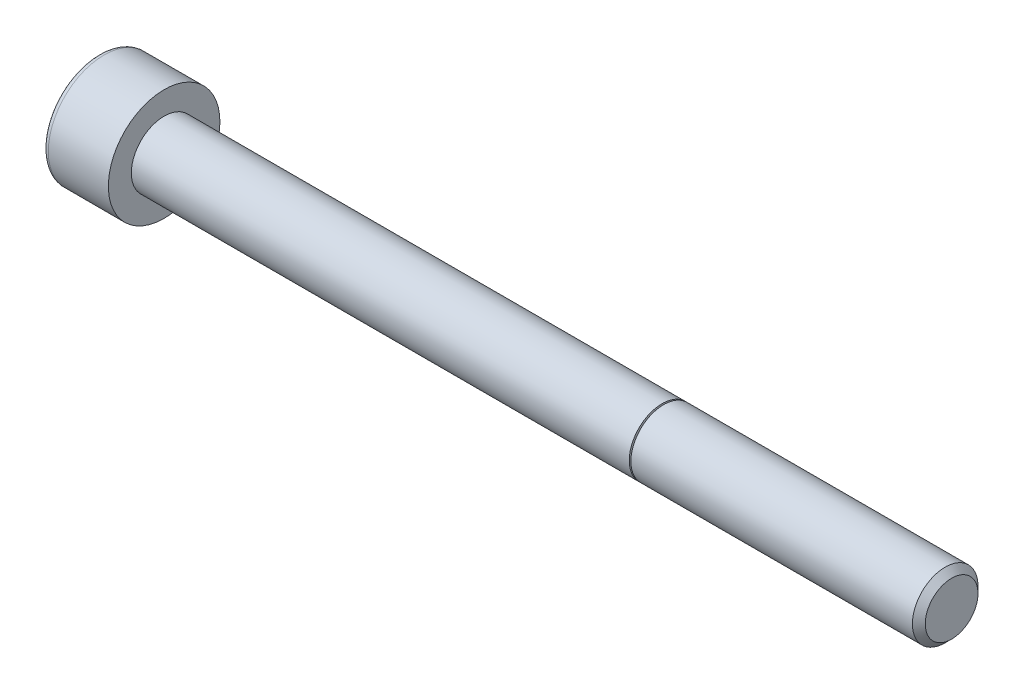
ISO-10303-21;
HEADER;
FILE_DESCRIPTION(('STEP AP214'),'2;1');
FILE_NAME('part.step','',(''),(''),'','','');
FILE_SCHEMA(('AUTOMOTIVE_DESIGN { 1 0 10303 214 1 1 1 1 }'));
ENDSEC;
DATA;
#1=APPLICATION_CONTEXT('core data for automotive mechanical design processes');
#2=APPLICATION_PROTOCOL_DEFINITION('international standard','automotive_design',2000,#1);
#3=PRODUCT_CONTEXT('',#1,'mechanical');
#4=PRODUCT('Part','Part','',(#3));
#5=PRODUCT_RELATED_PRODUCT_CATEGORY('part','',(#4));
#6=PRODUCT_DEFINITION_FORMATION('','',#4);
#7=PRODUCT_DEFINITION_CONTEXT('part definition',#1,'design');
#8=PRODUCT_DEFINITION('design','',#6,#7);
#9=PRODUCT_DEFINITION_SHAPE('','',#8);
#10=(LENGTH_UNIT() NAMED_UNIT(*) SI_UNIT(.MILLI.,.METRE.));
#11=(NAMED_UNIT(*) PLANE_ANGLE_UNIT() SI_UNIT($,.RADIAN.));
#12=(NAMED_UNIT(*) SI_UNIT($,.STERADIAN.) SOLID_ANGLE_UNIT());
#13=UNCERTAINTY_MEASURE_WITH_UNIT(LENGTH_MEASURE(1.E-05),#10,'distance_accuracy_value','');
#14=(GEOMETRIC_REPRESENTATION_CONTEXT(3) GLOBAL_UNCERTAINTY_ASSIGNED_CONTEXT((#13)) GLOBAL_UNIT_ASSIGNED_CONTEXT((#10,
#11,#12)) REPRESENTATION_CONTEXT('',''));
#15=CARTESIAN_POINT('',(0.,0.,0.));
#16=DIRECTION('',(0.,0.,1.));
#17=DIRECTION('',(1.,0.,0.));
#18=AXIS2_PLACEMENT_3D('',#15,#16,#17);
#19=CARTESIAN_POINT('',(60.,-2.04969,2.0095));
#20=DIRECTION('',(1.,0.,0.));
#21=DIRECTION('',(0.,0.,-1.));
#22=AXIS2_PLACEMENT_3D('',#19,#20,#21);
#23=PLANE('',#22);
#24=CARTESIAN_POINT('',(60.,0.,0.));
#25=DIRECTION('',(-1.,0.,0.));
#26=DIRECTION('',(0.,0.,1.));
#27=AXIS2_PLACEMENT_3D('',#24,#25,#26);
#28=CIRCLE('',#27,2.0095);
#29=CARTESIAN_POINT('',(60.,0.,2.0095));
#30=VERTEX_POINT('',#29);
#31=EDGE_CURVE('E20',#30,#30,#28,.T.);
#32=ORIENTED_EDGE('',*,*,#31,.F.);
#33=EDGE_LOOP('',(#32));
#34=FACE_BOUND('',#33,.T.);
#35=ADVANCED_FACE('F16',(#34),#23,.T.);
#36=CARTESIAN_POINT('',(60.,0.,0.));
#37=DIRECTION('',(-1.,0.,0.));
#38=DIRECTION('',(0.,0.,1.));
#39=AXIS2_PLACEMENT_3D('',#36,#37,#38);
#40=CONICAL_SURFACE('',#39,2.0095,0.785398163397458);
#41=ORIENTED_EDGE('',*,*,#31,.T.);
#42=EDGE_LOOP('',(#41));
#43=FACE_BOUND('',#42,.T.);
#44=CARTESIAN_POINT('',(59.5095,0.,0.));
#45=DIRECTION('',(-1.,0.,0.));
#46=DIRECTION('',(0.,-1.,0.));
#47=AXIS2_PLACEMENT_3D('',#44,#45,#46);
#48=CIRCLE('',#47,2.5);
#49=CARTESIAN_POINT('',(59.5095,-2.49999999999999,0.));
#50=VERTEX_POINT('',#49);
#51=EDGE_CURVE('E122',#50,#50,#48,.T.);
#52=ORIENTED_EDGE('',*,*,#51,.F.);
#53=EDGE_LOOP('',(#52));
#54=FACE_BOUND('',#53,.T.);
#55=ADVANCED_FACE('F235',(#43,#54),#40,.T.);
#56=CARTESIAN_POINT('',(59.5095,0.,0.));
#57=DIRECTION('',(-1.,0.,0.));
#58=DIRECTION('',(0.,-1.,0.));
#59=AXIS2_PLACEMENT_3D('',#56,#57,#58);
#60=CYLINDRICAL_SURFACE('',#59,2.5);
#61=CARTESIAN_POINT('',(38.0613125,0.,0.));
#62=DIRECTION('',(-1.,0.,0.));
#63=DIRECTION('',(0.,0.,1.));
#64=AXIS2_PLACEMENT_3D('',#61,#62,#63);
#65=CIRCLE('',#64,2.5);
#66=CARTESIAN_POINT('',(38.0613125,0.,2.5));
#67=VERTEX_POINT('',#66);
#68=EDGE_CURVE('E119',#67,#67,#65,.T.);
#69=ORIENTED_EDGE('',*,*,#68,.F.);
#70=EDGE_LOOP('',(#69));
#71=FACE_BOUND('',#70,.T.);
#72=ORIENTED_EDGE('',*,*,#51,.T.);
#73=EDGE_LOOP('',(#72));
#74=FACE_BOUND('',#73,.T.);
#75=ADVANCED_FACE('F229',(#71,#74),#60,.T.);
#76=CARTESIAN_POINT('',(38.,0.,0.));
#77=DIRECTION('',(1.,0.,0.));
#78=DIRECTION('',(0.,0.,-1.));
#79=AXIS2_PLACEMENT_3D('',#76,#77,#78);
#80=CONICAL_SURFACE('',#79,2.0094999999999,1.44644133224815);
#81=CARTESIAN_POINT('',(38.,0.,0.));
#82=DIRECTION('',(-1.,0.,0.));
#83=DIRECTION('',(0.,0.,1.));
#84=AXIS2_PLACEMENT_3D('',#81,#82,#83);
#85=CIRCLE('',#84,2.0094999999999);
#86=CARTESIAN_POINT('',(38.,0.,2.0094999999999));
#87=VERTEX_POINT('',#86);
#88=EDGE_CURVE('E116',#87,#87,#85,.T.);
#89=ORIENTED_EDGE('',*,*,#88,.F.);
#90=EDGE_LOOP('',(#89));
#91=FACE_BOUND('',#90,.T.);
#92=ORIENTED_EDGE('',*,*,#68,.T.);
#93=EDGE_LOOP('',(#92));
#94=FACE_BOUND('',#93,.T.);
#95=ADVANCED_FACE('F223',(#91,#94),#80,.T.);
#96=CARTESIAN_POINT('',(37.9386875,0.,0.));
#97=DIRECTION('',(-1.,0.,0.));
#98=DIRECTION('',(0.,0.,1.));
#99=AXIS2_PLACEMENT_3D('',#96,#97,#98);
#100=CONICAL_SURFACE('',#99,2.5,1.44644133224815);
#101=CARTESIAN_POINT('',(37.9386875,0.,0.));
#102=DIRECTION('',(-1.,0.,0.));
#103=DIRECTION('',(0.,0.,1.));
#104=AXIS2_PLACEMENT_3D('',#101,#102,#103);
#105=CIRCLE('',#104,2.5);
#106=CARTESIAN_POINT('',(37.9386875,0.,2.50000000000001));
#107=VERTEX_POINT('',#106);
#108=EDGE_CURVE('E113',#107,#107,#105,.T.);
#109=ORIENTED_EDGE('',*,*,#108,.F.);
#110=EDGE_LOOP('',(#109));
#111=FACE_BOUND('',#110,.T.);
#112=ORIENTED_EDGE('',*,*,#88,.T.);
#113=EDGE_LOOP('',(#112));
#114=FACE_BOUND('',#113,.T.);
#115=ADVANCED_FACE('F218',(#111,#114),#100,.T.);
#116=CARTESIAN_POINT('',(37.9386875,0.,0.));
#117=DIRECTION('',(-1.,0.,0.));
#118=DIRECTION('',(0.,0.,1.));
#119=AXIS2_PLACEMENT_3D('',#116,#117,#118);
#120=CYLINDRICAL_SURFACE('',#119,2.5);
#121=CARTESIAN_POINT('',(0.,0.,0.));
#122=DIRECTION('',(-1.,0.,0.));
#123=DIRECTION('',(0.,0.,1.));
#124=AXIS2_PLACEMENT_3D('',#121,#122,#123);
#125=CIRCLE('',#124,2.5);
#126=CARTESIAN_POINT('',(0.,0.,2.50000000000001));
#127=VERTEX_POINT('',#126);
#128=EDGE_CURVE('E92',#127,#127,#125,.T.);
#129=ORIENTED_EDGE('',*,*,#128,.F.);
#130=EDGE_LOOP('',(#129));
#131=FACE_BOUND('',#130,.T.);
#132=ORIENTED_EDGE('',*,*,#108,.T.);
#133=EDGE_LOOP('',(#132));
#134=FACE_BOUND('',#133,.T.);
#135=ADVANCED_FACE('F215',(#131,#134),#120,.T.);
#136=CARTESIAN_POINT('',(-1.9,0.,0.));
#137=DIRECTION('',(-1.,0.,0.));
#138=DIRECTION('',(0.,0.,1.));
#139=AXIS2_PLACEMENT_3D('',#136,#137,#138);
#140=CONICAL_SURFACE('',#139,2.3094010767585,1.0471975511966);
#141=CARTESIAN_POINT('',(-1.9,0.,2.3094010767585));
#142=CARTESIAN_POINT('',(-1.87069554512665,-0.0878878875630438,2.25865898121547));
#143=CARTESIAN_POINT('',(-1.84404467710022,-0.176534422121215,2.20747888062559));
#144=CARTESIAN_POINT('',(-1.79752638740027,-0.355362346686105,2.10423253023943));
#145=CARTESIAN_POINT('',(-1.77767542033809,-0.44554691308464,2.05216444655249));
#146=CARTESIAN_POINT('',(-1.74677595894609,-0.624798433758891,1.94867353283856));
#147=CARTESIAN_POINT('',(-1.73552178759691,-0.713837815616439,1.89726662175463));
#148=CARTESIAN_POINT('',(-1.72208916813045,-0.892335320462004,1.79421103928237));
#149=CARTESIAN_POINT('',(-1.7198995939742,-0.981792795105295,1.74256274221605));
#150=CARTESIAN_POINT('',(-1.72446629015479,-1.14893448970974,1.64606343984337));
#151=CARTESIAN_POINT('',(-1.73010128521626,-1.22664379064383,1.60119795403054));
#152=CARTESIAN_POINT('',(-1.74795730071816,-1.38155614176471,1.5117592664101));
#153=CARTESIAN_POINT('',(-1.76018441476867,-1.45875865655097,1.46718637371614));
#154=CARTESIAN_POINT('',(-1.79074983333835,-1.61399014172453,1.37756343396448));
#155=CARTESIAN_POINT('',(-1.80921764221832,-1.69199947538354,1.33252472417715));
#156=CARTESIAN_POINT('',(-1.85113176083937,-1.84685497000488,1.24311886267203));
#157=CARTESIAN_POINT('',(-1.87456822875222,-1.92370311331472,1.19875056644538));
#158=CARTESIAN_POINT('',(-1.90000000000001,-1.99999999999999,1.15470053837931));
#159=B_SPLINE_CURVE_WITH_KNOTS('',3,(#141,#142,#143,#144,#145,#146,#147,#148,#149,#150,#151,
#152,#153,#154,#155,#156,#157,#158),.UNSPECIFIED.,.F.,.F.,(4,2,2,2,2,2,2,2,4),(0.,
0.317016011556855,0.634793817027109,0.944707606152922,1.25424088889782,1.52370778263188,
1.79342419379439,2.06912162248864,2.34427797351492),.UNSPECIFIED.);
#160=CARTESIAN_POINT('',(-1.9,0.,2.3094010767585));
#161=VERTEX_POINT('',#160);
#162=CARTESIAN_POINT('',(-1.90000000000001,-2.,1.1547005383793));
#163=VERTEX_POINT('',#162);
#164=EDGE_CURVE('E82',#161,#163,#159,.T.);
#165=ORIENTED_EDGE('',*,*,#164,.F.);
#166=CARTESIAN_POINT('',(-1.90000000000002,2.,1.1547005383793));
#167=CARTESIAN_POINT('',(-1.87069554512667,1.91211211243696,1.20544263392233));
#168=CARTESIAN_POINT('',(-1.84404467710023,1.82346557787879,1.25662273451221));
#169=CARTESIAN_POINT('',(-1.79752638740028,1.6446376533139,1.35986908489837));
#170=CARTESIAN_POINT('',(-1.7776754203381,1.55445308691536,1.41193716858531));
#171=CARTESIAN_POINT('',(-1.74677595894609,1.37520156624111,1.51542808229924));
#172=CARTESIAN_POINT('',(-1.73552178759691,1.28616218438356,1.56683499338317));
#173=CARTESIAN_POINT('',(-1.72208916813045,1.10766467953799,1.66989057585543));
#174=CARTESIAN_POINT('',(-1.7198995939742,1.0182072048947,1.72153887292176));
#175=CARTESIAN_POINT('',(-1.72446629015479,0.851065510290257,1.81803817529444));
#176=CARTESIAN_POINT('',(-1.73010128521625,0.773356209356166,1.86290366110727));
#177=CARTESIAN_POINT('',(-1.74795730071815,0.618443858235278,1.95234234872771));
#178=CARTESIAN_POINT('',(-1.76018441476867,0.541241343449025,1.99691524142166));
#179=CARTESIAN_POINT('',(-1.79074983333834,0.386009858275461,2.08653818117332));
#180=CARTESIAN_POINT('',(-1.80921764221831,0.308000524616451,2.13157689096065));
#181=CARTESIAN_POINT('',(-1.85113176083936,0.153145029995107,2.22098275246578));
#182=CARTESIAN_POINT('',(-1.87456822875221,0.0762968866852722,2.26535104869243));
#183=CARTESIAN_POINT('',(-1.9,0.,2.3094010767585));
#184=B_SPLINE_CURVE_WITH_KNOTS('',3,(#166,#167,#168,#169,#170,#171,#172,#173,#174,#175,#176,
#177,#178,#179,#180,#181,#182,#183),.UNSPECIFIED.,.F.,.F.,(4,2,2,2,2,2,2,2,4),(0.,
0.317016011556859,0.634793817027117,0.944707606152934,1.25424088889784,1.5237077826319,
1.7934241937944,2.06912162248865,2.34427797351493),.UNSPECIFIED.);
#185=CARTESIAN_POINT('',(-1.90000000000001,2.,1.15470053837929));
#186=VERTEX_POINT('',#185);
#187=EDGE_CURVE('E79',#186,#161,#184,.T.);
#188=ORIENTED_EDGE('',*,*,#187,.F.);
#189=CARTESIAN_POINT('',(-1.9,2.,-1.15470053837923));
#190=CARTESIAN_POINT('',(-1.87069554512665,2.,-1.05321634729317));
#191=CARTESIAN_POINT('',(-1.84404467710021,2.,-0.950856146113392));
#192=CARTESIAN_POINT('',(-1.79752638740026,2.,-0.744363445341073));
#193=CARTESIAN_POINT('',(-1.77767542033809,2.,-0.640227277967187));
#194=CARTESIAN_POINT('',(-1.74677595894608,2.,-0.433245450539333));
#195=CARTESIAN_POINT('',(-1.7355217875969,2.,-0.330431628371469));
#196=CARTESIAN_POINT('',(-1.72208916813044,2.,-0.124320463426946));
#197=CARTESIAN_POINT('',(-1.71989959397419,2.,-0.0210238692942912));
#198=CARTESIAN_POINT('',(-1.72446629015478,2.,0.171974735451078));
#199=CARTESIAN_POINT('',(-1.73010128521625,2.,0.261705707076751));
#200=CARTESIAN_POINT('',(-1.74795730071815,2.,0.44058308231764));
#201=CARTESIAN_POINT('',(-1.76018441476866,2.,0.529728867705562));
#202=CARTESIAN_POINT('',(-1.79074983333834,2.,0.708974747208891));
#203=CARTESIAN_POINT('',(-1.80921764221831,2.,0.799052166783559));
#204=CARTESIAN_POINT('',(-1.85113176083936,2.,0.977863889793815));
#205=CARTESIAN_POINT('',(-1.87456822875222,2.,1.06660048224713));
#206=CARTESIAN_POINT('',(-1.90000000000001,2.,1.15470053837928));
#207=B_SPLINE_CURVE_WITH_KNOTS('',3,(#189,#190,#191,#192,#193,#194,#195,#196,#197,#198,#199,
#200,#201,#202,#203,#204,#205,#206),.UNSPECIFIED.,.F.,.F.,(4,2,2,2,2,2,2,2,4),(0.,
0.317016011556853,0.634793817027106,0.944707606152917,1.25424088889781,1.52370778263189,
1.7934241937944,2.06912162248866,2.34427797351496),.UNSPECIFIED.);
#208=CARTESIAN_POINT('',(-1.89999999999999,2.,-1.15470053837921));
#209=VERTEX_POINT('',#208);
#210=EDGE_CURVE('E67',#209,#186,#207,.T.);
#211=ORIENTED_EDGE('',*,*,#210,.F.);
#212=CARTESIAN_POINT('',(-1.9,0.,-2.3094010767585));
#213=CARTESIAN_POINT('',(-1.87069554512665,0.0878878875630413,-2.25865898121547));
#214=CARTESIAN_POINT('',(-1.84404467710021,0.17653442212121,-2.20747888062558));
#215=CARTESIAN_POINT('',(-1.79752638740026,0.355362346686095,-2.10423253023942));
#216=CARTESIAN_POINT('',(-1.77767542033808,0.445546913084628,-2.05216444655247));
#217=CARTESIAN_POINT('',(-1.74677595894607,0.624798433758874,-1.94867353283854));
#218=CARTESIAN_POINT('',(-1.73552178759689,0.71383781561642,-1.89726662175461));
#219=CARTESIAN_POINT('',(-1.72208916813043,0.89233532046198,-1.79421103928234));
#220=CARTESIAN_POINT('',(-1.71989959397418,0.981792795105269,-1.74256274221601));
#221=CARTESIAN_POINT('',(-1.72446629015476,1.14893448970971,-1.64606343984333));
#222=CARTESIAN_POINT('',(-1.73010128521623,1.2266437906438,-1.60119795403049));
#223=CARTESIAN_POINT('',(-1.74795730071813,1.3815561417647,-1.51175926641004));
#224=CARTESIAN_POINT('',(-1.76018441476864,1.45875865655095,-1.46718637371607));
#225=CARTESIAN_POINT('',(-1.79074983333831,1.61399014172452,-1.37756343396441));
#226=CARTESIAN_POINT('',(-1.80921764221829,1.69199947538354,-1.33252472417707));
#227=CARTESIAN_POINT('',(-1.85113176083934,1.84685497000489,-1.24311886267194));
#228=CARTESIAN_POINT('',(-1.87456822875219,1.92370311331472,-1.19875056644528));
#229=CARTESIAN_POINT('',(-1.89999999999999,2.,-1.1547005383792));
#230=B_SPLINE_CURVE_WITH_KNOTS('',3,(#212,#213,#214,#215,#216,#217,#218,#219,#220,#221,#222,
#223,#224,#225,#226,#227,#228,#229),.UNSPECIFIED.,.F.,.F.,(4,2,2,2,2,2,2,2,4),(0.,
0.317016011556855,0.634793817027109,0.944707606152921,1.25424088889782,1.5237077826319,
1.79342419379442,2.06912162248868,2.34427797351498),.UNSPECIFIED.);
#231=CARTESIAN_POINT('',(-1.9,0.,-2.3094010767585));
#232=VERTEX_POINT('',#231);
#233=EDGE_CURVE('E134',#232,#209,#230,.T.);
#234=ORIENTED_EDGE('',*,*,#233,.F.);
#235=CARTESIAN_POINT('',(-1.90000000000001,-1.99999999999999,-1.1547005383793));
#236=CARTESIAN_POINT('',(-1.87069554512666,-1.91211211243695,-1.20544263392233));
#237=CARTESIAN_POINT('',(-1.84404467710023,-1.82346557787878,-1.25662273451222));
#238=CARTESIAN_POINT('',(-1.79752638740027,-1.64463765331388,-1.35986908489838));
#239=CARTESIAN_POINT('',(-1.7776754203381,-1.55445308691535,-1.41193716858532));
#240=CARTESIAN_POINT('',(-1.74677595894609,-1.3752015662411,-1.51542808229924));
#241=CARTESIAN_POINT('',(-1.73552178759691,-1.28616218438355,-1.56683499338317));
#242=CARTESIAN_POINT('',(-1.72208916813045,-1.10766467953798,-1.66989057585543));
#243=CARTESIAN_POINT('',(-1.7198995939742,-1.01820720489469,-1.72153887292176));
#244=CARTESIAN_POINT('',(-1.72446629015479,-0.851065510290249,-1.81803817529444));
#245=CARTESIAN_POINT('',(-1.73010128521626,-0.773356209356158,-1.86290366110727));
#246=CARTESIAN_POINT('',(-1.74795730071816,-0.618443858235273,-1.95234234872771));
#247=CARTESIAN_POINT('',(-1.76018441476867,-0.541241343449019,-1.99691524142167));
#248=CARTESIAN_POINT('',(-1.79074983333834,-0.386009858275457,-2.08653818117332));
#249=CARTESIAN_POINT('',(-1.80921764221831,-0.308000524616448,-2.13157689096065));
#250=CARTESIAN_POINT('',(-1.85113176083936,-0.153145029995106,-2.22098275246578));
#251=CARTESIAN_POINT('',(-1.87456822875221,-0.0762968866852709,-2.26535104869243));
#252=CARTESIAN_POINT('',(-1.9,0.,-2.3094010767585));
#253=B_SPLINE_CURVE_WITH_KNOTS('',3,(#235,#236,#237,#238,#239,#240,#241,#242,#243,#244,#245,
#246,#247,#248,#249,#250,#251,#252),.UNSPECIFIED.,.F.,.F.,(4,2,2,2,2,2,2,2,4),(0.,
0.317016011556858,0.634793817027115,0.944707606152931,1.25424088889783,1.52370778263189,
1.79342419379439,2.06912162248864,2.34427797351492),.UNSPECIFIED.);
#254=CARTESIAN_POINT('',(-1.90000000000001,-2.,-1.1547005383793));
#255=VERTEX_POINT('',#254);
#256=EDGE_CURVE('E142',#255,#232,#253,.T.);
#257=ORIENTED_EDGE('',*,*,#256,.F.);
#258=CARTESIAN_POINT('',(-1.90000000000001,-2.,1.15470053837929));
#259=CARTESIAN_POINT('',(-1.87069554512666,-2.,1.05321634729323));
#260=CARTESIAN_POINT('',(-1.84404467710023,-2.,0.950856146113455));
#261=CARTESIAN_POINT('',(-1.79752638740027,-2.,0.744363445341134));
#262=CARTESIAN_POINT('',(-1.7776754203381,-2.,0.640227277967246));
#263=CARTESIAN_POINT('',(-1.74677595894609,-2.,0.43324545053939));
#264=CARTESIAN_POINT('',(-1.73552178759691,-2.,0.330431628371524));
#265=CARTESIAN_POINT('',(-1.72208916813044,-2.,0.124320463426999));
#266=CARTESIAN_POINT('',(-1.71989959397419,-2.,0.0210238692943427));
#267=CARTESIAN_POINT('',(-1.72446629015478,-2.,-0.171974735451032));
#268=CARTESIAN_POINT('',(-1.73010128521624,-2.,-0.261705707076711));
#269=CARTESIAN_POINT('',(-1.74795730071814,-2.,-0.440583082317611));
#270=CARTESIAN_POINT('',(-1.76018441476866,-2.,-0.529728867705538));
#271=CARTESIAN_POINT('',(-1.79074983333833,-2.,-0.708974747208878));
#272=CARTESIAN_POINT('',(-1.80921764221831,-2.,-0.799052166783552));
#273=CARTESIAN_POINT('',(-1.85113176083936,-2.,-0.977863889793819));
#274=CARTESIAN_POINT('',(-1.87456822875222,-2.,-1.06660048224714));
#275=CARTESIAN_POINT('',(-1.90000000000001,-2.,-1.15470053837929));
#276=B_SPLINE_CURVE_WITH_KNOTS('',3,(#258,#259,#260,#261,#262,#263,#264,#265,#266,#267,#268,
#269,#270,#271,#272,#273,#274,#275),.UNSPECIFIED.,.F.,.F.,(4,2,2,2,2,2,2,2,4),(0.,
0.317016011556858,0.634793817027115,0.944707606152931,1.25424088889783,1.52370778263192,
1.79342419379445,2.06912162248873,2.34427797351504),.UNSPECIFIED.);
#277=EDGE_CURVE('E184',#163,#255,#276,.T.);
#278=ORIENTED_EDGE('',*,*,#277,.F.);
#279=EDGE_LOOP('',(#165,#188,#211,#234,#257,#278));
#280=FACE_BOUND('',#279,.T.);
#281=CARTESIAN_POINT('',(-0.56666666666667,0.,0.));
#282=VERTEX_POINT('',#281);
#283=VERTEX_LOOP('',#282);
#284=FACE_BOUND('',#283,.T.);
#285=ADVANCED_FACE('F80',(#280,#284),#140,.F.);
#286=CARTESIAN_POINT('',(0.,-4.335,4.25));
#287=DIRECTION('',(1.,0.,0.));
#288=DIRECTION('',(0.,0.,-1.));
#289=AXIS2_PLACEMENT_3D('',#286,#287,#288);
#290=PLANE('',#289);
#291=CARTESIAN_POINT('',(0.,0.,0.));
#292=DIRECTION('',(1.,0.,0.));
#293=DIRECTION('',(0.,0.,-1.));
#294=AXIS2_PLACEMENT_3D('',#291,#292,#293);
#295=CIRCLE('',#294,4.25);
#296=CARTESIAN_POINT('',(0.,0.,-4.25));
#297=VERTEX_POINT('',#296);
#298=EDGE_CURVE('E107',#297,#297,#295,.F.);
#299=ORIENTED_EDGE('',*,*,#298,.F.);
#300=EDGE_LOOP('',(#299));
#301=FACE_BOUND('',#300,.T.);
#302=ORIENTED_EDGE('',*,*,#128,.T.);
#303=EDGE_LOOP('',(#302));
#304=FACE_BOUND('',#303,.T.);
#305=ADVANCED_FACE('F213',(#301,#304),#290,.T.);
#306=CARTESIAN_POINT('',(-5.,2.,-1.1547005383793));
#307=DIRECTION('',(0.,-1.,0.));
#308=DIRECTION('',(1.,0.,0.));
#309=AXIS2_PLACEMENT_3D('',#306,#307,#308);
#310=PLANE('',#309);
#311=DIRECTION('',(0.,0.,1.));
#312=VECTOR('',#311,1.);
#313=CARTESIAN_POINT('',(-4.99999999995,2.,0.));
#314=LINE('',#313,#312);
#315=CARTESIAN_POINT('',(-4.99999999995,2.,-1.15470053837925));
#316=VERTEX_POINT('',#315);
#317=CARTESIAN_POINT('',(-4.99999999995,2.,1.1547005383793));
#318=VERTEX_POINT('',#317);
#319=EDGE_CURVE('E72',#316,#318,#314,.T.);
#320=ORIENTED_EDGE('',*,*,#319,.F.);
#321=DIRECTION('',(-1.,0.,0.));
#322=VECTOR('',#321,1.);
#323=CARTESIAN_POINT('',(-3.28333333333335,2.,-1.1547005383792));
#324=LINE('',#323,#322);
#325=EDGE_CURVE('E90',#209,#316,#324,.T.);
#326=ORIENTED_EDGE('',*,*,#325,.F.);
#327=ORIENTED_EDGE('',*,*,#210,.T.);
#328=DIRECTION('',(1.,0.,0.));
#329=VECTOR('',#328,1.);
#330=CARTESIAN_POINT('',(-3.28333333333335,2.,1.1547005383793));
#331=LINE('',#330,#329);
#332=EDGE_CURVE('E86',#318,#186,#331,.T.);
#333=ORIENTED_EDGE('',*,*,#332,.F.);
#334=EDGE_LOOP('',(#320,#326,#327,#333));
#335=FACE_BOUND('',#334,.T.);
#336=ADVANCED_FACE('F88',(#335),#310,.T.);
#337=CARTESIAN_POINT('',(-5.,2.,1.1547005383793));
#338=DIRECTION('',(0.,-0.499999999999983,-0.866025403784448));
#339=DIRECTION('',(1.,0.,0.));
#340=AXIS2_PLACEMENT_3D('',#337,#338,#339);
#341=PLANE('',#340);
#342=DIRECTION('',(0.,-0.866025403784448,0.499999999999983));
#343=VECTOR('',#342,1.);
#344=CARTESIAN_POINT('',(-4.99999999995,2.,1.1547005383793));
#345=LINE('',#344,#343);
#346=CARTESIAN_POINT('',(-4.99999999995,0.,2.3094010767585));
#347=VERTEX_POINT('',#346);
#348=EDGE_CURVE('E96',#318,#347,#345,.T.);
#349=ORIENTED_EDGE('',*,*,#348,.F.);
#350=ORIENTED_EDGE('',*,*,#332,.T.);
#351=ORIENTED_EDGE('',*,*,#187,.T.);
#352=DIRECTION('',(1.,0.,0.));
#353=VECTOR('',#352,1.);
#354=CARTESIAN_POINT('',(-3.28333333333335,0.,2.3094010767585));
#355=LINE('',#354,#353);
#356=EDGE_CURVE('E98',#347,#161,#355,.T.);
#357=ORIENTED_EDGE('',*,*,#356,.F.);
#358=EDGE_LOOP('',(#349,#350,#351,#357));
#359=FACE_BOUND('',#358,.T.);
#360=ADVANCED_FACE('F94',(#359),#341,.T.);
#361=CARTESIAN_POINT('',(-5.,0.,2.3094010767585));
#362=DIRECTION('',(0.,0.499999999999983,-0.866025403784448));
#363=DIRECTION('',(1.,0.,0.));
#364=AXIS2_PLACEMENT_3D('',#361,#362,#363);
#365=PLANE('',#364);
#366=DIRECTION('',(0.,-0.866025403784448,-0.499999999999983));
#367=VECTOR('',#366,1.);
#368=CARTESIAN_POINT('',(-4.99999999995,0.,2.3094010767585));
#369=LINE('',#368,#367);
#370=CARTESIAN_POINT('',(-4.99999999995,-2.,1.1547005383793));
#371=VERTEX_POINT('',#370);
#372=EDGE_CURVE('E112',#347,#371,#369,.T.);
#373=ORIENTED_EDGE('',*,*,#372,.F.);
#374=ORIENTED_EDGE('',*,*,#356,.T.);
#375=ORIENTED_EDGE('',*,*,#164,.T.);
#376=DIRECTION('',(1.,0.,0.));
#377=VECTOR('',#376,1.);
#378=CARTESIAN_POINT('',(-3.28333333333335,-2.,1.1547005383793));
#379=LINE('',#378,#377);
#380=EDGE_CURVE('E180',#371,#163,#379,.T.);
#381=ORIENTED_EDGE('',*,*,#380,.F.);
#382=EDGE_LOOP('',(#373,#374,#375,#381));
#383=FACE_BOUND('',#382,.T.);
#384=ADVANCED_FACE('F195',(#383),#365,.T.);
#385=CARTESIAN_POINT('',(-5.,-2.,1.1547005383793));
#386=DIRECTION('',(0.,1.,0.));
#387=DIRECTION('',(1.,0.,0.));
#388=AXIS2_PLACEMENT_3D('',#385,#386,#387);
#389=PLANE('',#388);
#390=DIRECTION('',(0.,0.,-1.));
#391=VECTOR('',#390,1.);
#392=CARTESIAN_POINT('',(-4.99999999995,-2.,0.));
#393=LINE('',#392,#391);
#394=CARTESIAN_POINT('',(-4.99999999995,-2.,-1.1547005383793));
#395=VERTEX_POINT('',#394);
#396=EDGE_CURVE('E108',#371,#395,#393,.T.);
#397=ORIENTED_EDGE('',*,*,#396,.F.);
#398=ORIENTED_EDGE('',*,*,#380,.T.);
#399=ORIENTED_EDGE('',*,*,#277,.T.);
#400=DIRECTION('',(1.,0.,0.));
#401=VECTOR('',#400,1.);
#402=CARTESIAN_POINT('',(-3.28333333333335,-2.,-1.1547005383793));
#403=LINE('',#402,#401);
#404=EDGE_CURVE('E141',#395,#255,#403,.T.);
#405=ORIENTED_EDGE('',*,*,#404,.F.);
#406=EDGE_LOOP('',(#397,#398,#399,#405));
#407=FACE_BOUND('',#406,.T.);
#408=ADVANCED_FACE('F192',(#407),#389,.T.);
#409=CARTESIAN_POINT('',(-5.,-2.,-1.1547005383793));
#410=DIRECTION('',(0.,0.499999999999983,0.866025403784448));
#411=DIRECTION('',(1.,0.,0.));
#412=AXIS2_PLACEMENT_3D('',#409,#410,#411);
#413=PLANE('',#412);
#414=DIRECTION('',(0.,0.866025403784448,-0.499999999999983));
#415=VECTOR('',#414,1.);
#416=CARTESIAN_POINT('',(-4.99999999995,-2.,-1.1547005383793));
#417=LINE('',#416,#415);
#418=CARTESIAN_POINT('',(-4.99999999995,0.,-2.3094010767585));
#419=VERTEX_POINT('',#418);
#420=EDGE_CURVE('E111',#395,#419,#417,.T.);
#421=ORIENTED_EDGE('',*,*,#420,.F.);
#422=ORIENTED_EDGE('',*,*,#404,.T.);
#423=ORIENTED_EDGE('',*,*,#256,.T.);
#424=DIRECTION('',(1.,0.,0.));
#425=VECTOR('',#424,1.);
#426=CARTESIAN_POINT('',(-3.28333333333335,0.,-2.3094010767585));
#427=LINE('',#426,#425);
#428=EDGE_CURVE('E35',#419,#232,#427,.T.);
#429=ORIENTED_EDGE('',*,*,#428,.F.);
#430=EDGE_LOOP('',(#421,#422,#423,#429));
#431=FACE_BOUND('',#430,.T.);
#432=ADVANCED_FACE('F156',(#431),#413,.T.);
#433=CARTESIAN_POINT('',(-5.,0.,-2.3094010767585));
#434=DIRECTION('',(0.,-0.500000000000015,0.86602540378443));
#435=DIRECTION('',(1.,0.,0.));
#436=AXIS2_PLACEMENT_3D('',#433,#434,#435);
#437=PLANE('',#436);
#438=DIRECTION('',(0.,0.866025403784448,0.499999999999983));
#439=VECTOR('',#438,1.);
#440=CARTESIAN_POINT('',(-4.99999999995,0.,-2.3094010767585));
#441=LINE('',#440,#439);
#442=EDGE_CURVE('E105',#419,#316,#441,.T.);
#443=ORIENTED_EDGE('',*,*,#442,.F.);
#444=ORIENTED_EDGE('',*,*,#428,.T.);
#445=ORIENTED_EDGE('',*,*,#233,.T.);
#446=ORIENTED_EDGE('',*,*,#325,.T.);
#447=EDGE_LOOP('',(#443,#444,#445,#446));
#448=FACE_BOUND('',#447,.T.);
#449=ADVANCED_FACE('F151',(#448),#437,.T.);
#450=CARTESIAN_POINT('',(-4.575,0.,0.));
#451=DIRECTION('',(1.,0.,0.));
#452=DIRECTION('',(0.,0.,-1.));
#453=AXIS2_PLACEMENT_3D('',#450,#451,#452);
#454=CYLINDRICAL_SURFACE('',#453,4.25);
#455=ORIENTED_EDGE('',*,*,#298,.T.);
#456=EDGE_LOOP('',(#455));
#457=FACE_BOUND('',#456,.T.);
#458=CARTESIAN_POINT('',(-4.575,0.,0.));
#459=DIRECTION('',(-1.,0.,0.));
#460=DIRECTION('',(0.,0.,1.));
#461=AXIS2_PLACEMENT_3D('',#458,#459,#460);
#462=CIRCLE('',#461,4.2499999999);
#463=CARTESIAN_POINT('',(-4.575,0.,4.2499999999));
#464=VERTEX_POINT('',#463);
#465=EDGE_CURVE('E26',#464,#464,#462,.T.);
#466=ORIENTED_EDGE('',*,*,#465,.F.);
#467=EDGE_LOOP('',(#466));
#468=FACE_BOUND('',#467,.T.);
#469=ADVANCED_FACE('F155',(#457,#468),#454,.T.);
#470=CARTESIAN_POINT('',(-4.99999999995,-3.9015,-3.825));
#471=DIRECTION('',(-1.,0.,0.));
#472=DIRECTION('',(0.,0.,1.));
#473=AXIS2_PLACEMENT_3D('',#470,#471,#472);
#474=PLANE('',#473);
#475=ORIENTED_EDGE('',*,*,#420,.T.);
#476=ORIENTED_EDGE('',*,*,#442,.T.);
#477=ORIENTED_EDGE('',*,*,#319,.T.);
#478=ORIENTED_EDGE('',*,*,#348,.T.);
#479=ORIENTED_EDGE('',*,*,#372,.T.);
#480=ORIENTED_EDGE('',*,*,#396,.T.);
#481=EDGE_LOOP('',(#475,#476,#477,#478,#479,#480));
#482=FACE_BOUND('',#481,.T.);
#483=CARTESIAN_POINT('',(-4.9999999999,0.,0.));
#484=DIRECTION('',(1.,0.,0.));
#485=DIRECTION('',(0.,0.,-1.));
#486=AXIS2_PLACEMENT_3D('',#483,#484,#485);
#487=CIRCLE('',#486,3.82499999995044);
#488=CARTESIAN_POINT('',(-4.9999999999,0.,-3.82499999995044));
#489=VERTEX_POINT('',#488);
#490=EDGE_CURVE('E10',#489,#489,#487,.T.);
#491=ORIENTED_EDGE('',*,*,#490,.F.);
#492=EDGE_LOOP('',(#491));
#493=FACE_BOUND('',#492,.T.);
#494=ADVANCED_FACE('F161',(#482,#493),#474,.T.);
#495=CARTESIAN_POINT('',(-4.5749999999,0.,0.));
#496=DIRECTION('',(1.,0.,0.));
#497=DIRECTION('',(0.,0.,-1.));
#498=AXIS2_PLACEMENT_3D('',#495,#496,#497);
#499=TOROIDAL_SURFACE('',#498,3.8249999999,0.425000000000002);
#500=ORIENTED_EDGE('',*,*,#490,.T.);
#501=EDGE_LOOP('',(#500));
#502=FACE_BOUND('',#501,.T.);
#503=ORIENTED_EDGE('',*,*,#465,.T.);
#504=EDGE_LOOP('',(#503));
#505=FACE_BOUND('',#504,.T.);
#506=ADVANCED_FACE('F18',(#502,#505),#499,.T.);
#507=CLOSED_SHELL('',(#35,#55,#75,#95,#115,#135,#285,#305,#336,#360,#384,#408,#432,#449,#469,
#494,#506));
#508=MANIFOLD_SOLID_BREP('B1',#507);
#509=ADVANCED_BREP_SHAPE_REPRESENTATION('',(#18,#508),#14);
#510=SHAPE_DEFINITION_REPRESENTATION(#9,#509);
ENDSEC;
END-ISO-10303-21;
